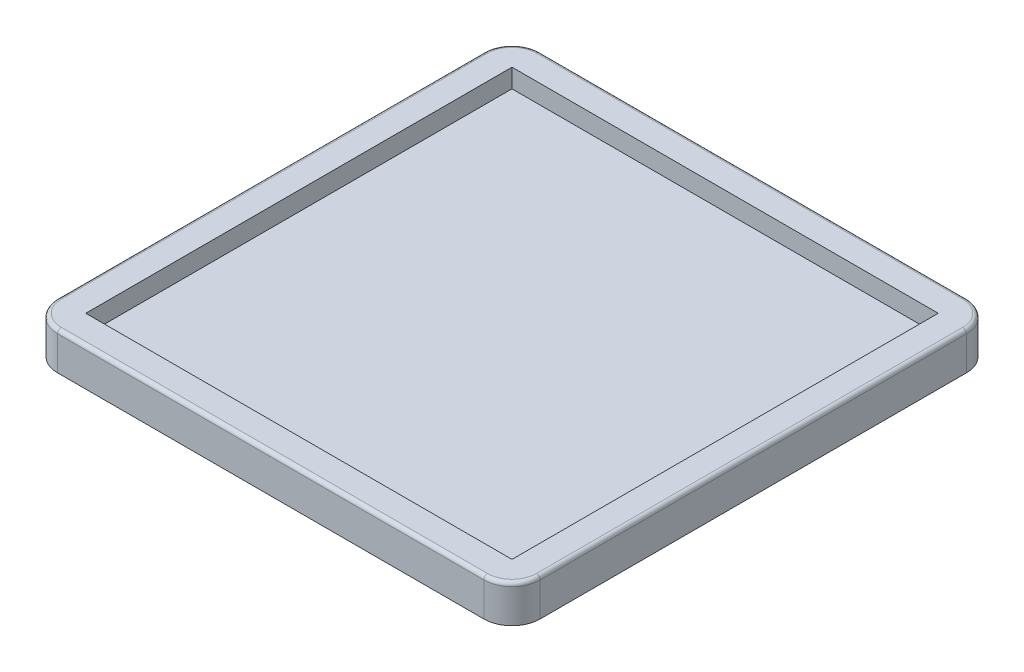
ISO-10303-21;
HEADER;
FILE_DESCRIPTION(('STEP AP214'),'2;1');
FILE_NAME('part.step','',(''),(''),'','','');
FILE_SCHEMA(('AUTOMOTIVE_DESIGN { 1 0 10303 214 1 1 1 1 }'));
ENDSEC;
DATA;
#1=APPLICATION_CONTEXT('core data for automotive mechanical design processes');
#2=APPLICATION_PROTOCOL_DEFINITION('international standard','automotive_design',2000,#1);
#3=PRODUCT_CONTEXT('',#1,'mechanical');
#4=PRODUCT('Part','Part','',(#3));
#5=PRODUCT_RELATED_PRODUCT_CATEGORY('part','',(#4));
#6=PRODUCT_DEFINITION_FORMATION('','',#4);
#7=PRODUCT_DEFINITION_CONTEXT('part definition',#1,'design');
#8=PRODUCT_DEFINITION('design','',#6,#7);
#9=PRODUCT_DEFINITION_SHAPE('','',#8);
#10=(LENGTH_UNIT() NAMED_UNIT(*) SI_UNIT(.MILLI.,.METRE.));
#11=(NAMED_UNIT(*) PLANE_ANGLE_UNIT() SI_UNIT($,.RADIAN.));
#12=(NAMED_UNIT(*) SI_UNIT($,.STERADIAN.) SOLID_ANGLE_UNIT());
#13=UNCERTAINTY_MEASURE_WITH_UNIT(LENGTH_MEASURE(1.E-05),#10,'distance_accuracy_value','');
#14=(GEOMETRIC_REPRESENTATION_CONTEXT(3) GLOBAL_UNCERTAINTY_ASSIGNED_CONTEXT((#13)) GLOBAL_UNIT_ASSIGNED_CONTEXT((#10,
#11,#12)) REPRESENTATION_CONTEXT('',''));
#15=CARTESIAN_POINT('',(0.,0.,0.));
#16=DIRECTION('',(0.,0.,1.));
#17=DIRECTION('',(1.,0.,0.));
#18=AXIS2_PLACEMENT_3D('',#15,#16,#17);
#19=CARTESIAN_POINT('',(64.25,10.,-64.25));
#20=DIRECTION('',(-1.,0.,0.));
#21=DIRECTION('',(0.,0.,1.));
#22=AXIS2_PLACEMENT_3D('',#19,#20,#21);
#23=PLANE('',#22);
#24=DIRECTION('',(0.,-1.,0.));
#25=VECTOR('',#24,1.);
#26=CARTESIAN_POINT('',(64.25,10.,-56.75));
#27=LINE('',#26,#25);
#28=CARTESIAN_POINT('',(64.25,0.,-56.75));
#29=VERTEX_POINT('',#28);
#30=CARTESIAN_POINT('',(64.25,9.,-56.75));
#31=VERTEX_POINT('',#30);
#32=EDGE_CURVE('E205',#29,#31,#27,.F.);
#33=ORIENTED_EDGE('',*,*,#32,.T.);
#34=DIRECTION('',(0.,0.,-1.));
#35=VECTOR('',#34,1.);
#36=CARTESIAN_POINT('',(64.25,9.,56.75));
#37=LINE('',#36,#35);
#38=CARTESIAN_POINT('',(64.25,9.,56.75));
#39=VERTEX_POINT('',#38);
#40=EDGE_CURVE('E255',#31,#39,#37,.F.);
#41=ORIENTED_EDGE('',*,*,#40,.T.);
#42=DIRECTION('',(0.,-1.,0.));
#43=VECTOR('',#42,1.);
#44=CARTESIAN_POINT('',(64.25,10.,56.75));
#45=LINE('',#44,#43);
#46=CARTESIAN_POINT('',(64.25,0.,56.75));
#47=VERTEX_POINT('',#46);
#48=EDGE_CURVE('E208',#39,#47,#45,.T.);
#49=ORIENTED_EDGE('',*,*,#48,.T.);
#50=DIRECTION('',(0.,0.,-1.));
#51=VECTOR('',#50,1.);
#52=CARTESIAN_POINT('',(64.25,0.,-64.25));
#53=LINE('',#52,#51);
#54=EDGE_CURVE('E190',#47,#29,#53,.T.);
#55=ORIENTED_EDGE('',*,*,#54,.T.);
#56=EDGE_LOOP('',(#33,#41,#49,#55));
#57=FACE_BOUND('',#56,.T.);
#58=ADVANCED_FACE('F36',(#57),#23,.F.);
#59=CARTESIAN_POINT('',(-64.25,10.,-64.25));
#60=DIRECTION('',(0.,0.,1.));
#61=DIRECTION('',(1.,0.,0.));
#62=AXIS2_PLACEMENT_3D('',#59,#60,#61);
#63=PLANE('',#62);
#64=DIRECTION('',(0.,-1.,0.));
#65=VECTOR('',#64,1.);
#66=CARTESIAN_POINT('',(-56.75,10.,-64.25));
#67=LINE('',#66,#65);
#68=CARTESIAN_POINT('',(-56.75,0.,-64.25));
#69=VERTEX_POINT('',#68);
#70=CARTESIAN_POINT('',(-56.75,9.,-64.25));
#71=VERTEX_POINT('',#70);
#72=EDGE_CURVE('E222',#69,#71,#67,.F.);
#73=ORIENTED_EDGE('',*,*,#72,.T.);
#74=DIRECTION('',(-1.,0.,0.));
#75=VECTOR('',#74,1.);
#76=CARTESIAN_POINT('',(56.75,9.,-64.25));
#77=LINE('',#76,#75);
#78=CARTESIAN_POINT('',(56.75,9.,-64.25));
#79=VERTEX_POINT('',#78);
#80=EDGE_CURVE('E251',#71,#79,#77,.F.);
#81=ORIENTED_EDGE('',*,*,#80,.T.);
#82=DIRECTION('',(0.,-1.,0.));
#83=VECTOR('',#82,1.);
#84=CARTESIAN_POINT('',(56.75,10.,-64.25));
#85=LINE('',#84,#83);
#86=CARTESIAN_POINT('',(56.75,0.,-64.25));
#87=VERTEX_POINT('',#86);
#88=EDGE_CURVE('E225',#79,#87,#85,.T.);
#89=ORIENTED_EDGE('',*,*,#88,.T.);
#90=DIRECTION('',(-1.,0.,0.));
#91=VECTOR('',#90,1.);
#92=CARTESIAN_POINT('',(-64.25,0.,-64.25));
#93=LINE('',#92,#91);
#94=EDGE_CURVE('E196',#87,#69,#93,.T.);
#95=ORIENTED_EDGE('',*,*,#94,.T.);
#96=EDGE_LOOP('',(#73,#81,#89,#95));
#97=FACE_BOUND('',#96,.T.);
#98=ADVANCED_FACE('F353',(#97),#63,.F.);
#99=CARTESIAN_POINT('',(-64.25,10.,-64.25));
#100=DIRECTION('',(1.,0.,0.));
#101=DIRECTION('',(0.,0.,-1.));
#102=AXIS2_PLACEMENT_3D('',#99,#100,#101);
#103=PLANE('',#102);
#104=DIRECTION('',(0.,-1.,0.));
#105=VECTOR('',#104,1.);
#106=CARTESIAN_POINT('',(-64.25,10.,56.75));
#107=LINE('',#106,#105);
#108=CARTESIAN_POINT('',(-64.25,0.,56.75));
#109=VERTEX_POINT('',#108);
#110=CARTESIAN_POINT('',(-64.25,9.,56.75));
#111=VERTEX_POINT('',#110);
#112=EDGE_CURVE('E227',#109,#111,#107,.F.);
#113=ORIENTED_EDGE('',*,*,#112,.T.);
#114=DIRECTION('',(0.,0.,1.));
#115=VECTOR('',#114,1.);
#116=CARTESIAN_POINT('',(-64.25,9.,-56.75));
#117=LINE('',#116,#115);
#118=CARTESIAN_POINT('',(-64.25,9.,-56.75));
#119=VERTEX_POINT('',#118);
#120=EDGE_CURVE('E11',#111,#119,#117,.F.);
#121=ORIENTED_EDGE('',*,*,#120,.T.);
#122=DIRECTION('',(0.,-1.,0.));
#123=VECTOR('',#122,1.);
#124=CARTESIAN_POINT('',(-64.25,10.,-56.75));
#125=LINE('',#124,#123);
#126=CARTESIAN_POINT('',(-64.25,0.,-56.75));
#127=VERTEX_POINT('',#126);
#128=EDGE_CURVE('E229',#119,#127,#125,.T.);
#129=ORIENTED_EDGE('',*,*,#128,.T.);
#130=DIRECTION('',(0.,0.,1.));
#131=VECTOR('',#130,1.);
#132=CARTESIAN_POINT('',(-64.25,0.,-64.25));
#133=LINE('',#132,#131);
#134=EDGE_CURVE('E199',#127,#109,#133,.T.);
#135=ORIENTED_EDGE('',*,*,#134,.T.);
#136=EDGE_LOOP('',(#113,#121,#129,#135));
#137=FACE_BOUND('',#136,.T.);
#138=ADVANCED_FACE('F337',(#137),#103,.F.);
#139=CARTESIAN_POINT('',(-64.25,10.,64.25));
#140=DIRECTION('',(0.,0.,-1.));
#141=DIRECTION('',(-1.,0.,0.));
#142=AXIS2_PLACEMENT_3D('',#139,#140,#141);
#143=PLANE('',#142);
#144=DIRECTION('',(0.,-1.,0.));
#145=VECTOR('',#144,1.);
#146=CARTESIAN_POINT('',(56.75,10.,64.25));
#147=LINE('',#146,#145);
#148=CARTESIAN_POINT('',(56.75,0.,64.25));
#149=VERTEX_POINT('',#148);
#150=CARTESIAN_POINT('',(56.75,9.,64.25));
#151=VERTEX_POINT('',#150);
#152=EDGE_CURVE('E220',#149,#151,#147,.F.);
#153=ORIENTED_EDGE('',*,*,#152,.T.);
#154=DIRECTION('',(1.,0.,0.));
#155=VECTOR('',#154,1.);
#156=CARTESIAN_POINT('',(-56.75,9.,64.25));
#157=LINE('',#156,#155);
#158=CARTESIAN_POINT('',(-56.75,9.,64.25));
#159=VERTEX_POINT('',#158);
#160=EDGE_CURVE('E60',#151,#159,#157,.F.);
#161=ORIENTED_EDGE('',*,*,#160,.T.);
#162=DIRECTION('',(0.,-1.,0.));
#163=VECTOR('',#162,1.);
#164=CARTESIAN_POINT('',(-56.75,10.,64.25));
#165=LINE('',#164,#163);
#166=CARTESIAN_POINT('',(-56.75,0.,64.25));
#167=VERTEX_POINT('',#166);
#168=EDGE_CURVE('E218',#159,#167,#165,.T.);
#169=ORIENTED_EDGE('',*,*,#168,.T.);
#170=DIRECTION('',(1.,0.,0.));
#171=VECTOR('',#170,1.);
#172=CARTESIAN_POINT('',(-64.25,0.,64.25));
#173=LINE('',#172,#171);
#174=EDGE_CURVE('E202',#167,#149,#173,.T.);
#175=ORIENTED_EDGE('',*,*,#174,.T.);
#176=EDGE_LOOP('',(#153,#161,#169,#175));
#177=FACE_BOUND('',#176,.T.);
#178=ADVANCED_FACE('F296',(#177),#143,.F.);
#179=CARTESIAN_POINT('',(0.,10.,0.));
#180=DIRECTION('',(0.,1.,0.));
#181=DIRECTION('',(0.,0.,1.));
#182=AXIS2_PLACEMENT_3D('',#179,#180,#181);
#183=PLANE('',#182);
#184=DIRECTION('',(-1.,0.,0.));
#185=VECTOR('',#184,1.);
#186=CARTESIAN_POINT('',(-56.75,10.,-63.25));
#187=LINE('',#186,#185);
#188=CARTESIAN_POINT('',(56.75,10.,-63.25));
#189=VERTEX_POINT('',#188);
#190=CARTESIAN_POINT('',(-56.75,10.,-63.25));
#191=VERTEX_POINT('',#190);
#192=EDGE_CURVE('E243',#189,#191,#187,.T.);
#193=ORIENTED_EDGE('',*,*,#192,.T.);
#194=CARTESIAN_POINT('',(-56.75,10.,-56.75));
#195=DIRECTION('',(0.,1.,0.));
#196=DIRECTION('',(0.,0.,1.));
#197=AXIS2_PLACEMENT_3D('',#194,#195,#196);
#198=CIRCLE('',#197,6.5);
#199=CARTESIAN_POINT('',(-63.25,10.,-56.75));
#200=VERTEX_POINT('',#199);
#201=EDGE_CURVE('E245',#191,#200,#198,.T.);
#202=ORIENTED_EDGE('',*,*,#201,.T.);
#203=DIRECTION('',(0.,0.,1.));
#204=VECTOR('',#203,1.);
#205=CARTESIAN_POINT('',(-63.25,10.,56.75));
#206=LINE('',#205,#204);
#207=CARTESIAN_POINT('',(-63.25,10.,56.75));
#208=VERTEX_POINT('',#207);
#209=EDGE_CURVE('E231',#200,#208,#206,.T.);
#210=ORIENTED_EDGE('',*,*,#209,.T.);
#211=CARTESIAN_POINT('',(-56.75,10.,56.75));
#212=DIRECTION('',(0.,1.,0.));
#213=DIRECTION('',(0.,0.,1.));
#214=AXIS2_PLACEMENT_3D('',#211,#212,#213);
#215=CIRCLE('',#214,6.5);
#216=CARTESIAN_POINT('',(-56.75,10.,63.25));
#217=VERTEX_POINT('',#216);
#218=EDGE_CURVE('E233',#208,#217,#215,.T.);
#219=ORIENTED_EDGE('',*,*,#218,.T.);
#220=DIRECTION('',(1.,0.,0.));
#221=VECTOR('',#220,1.);
#222=CARTESIAN_POINT('',(56.75,10.,63.25));
#223=LINE('',#222,#221);
#224=CARTESIAN_POINT('',(56.75,10.,63.25));
#225=VERTEX_POINT('',#224);
#226=EDGE_CURVE('E235',#217,#225,#223,.T.);
#227=ORIENTED_EDGE('',*,*,#226,.T.);
#228=CARTESIAN_POINT('',(56.75,10.,56.75));
#229=DIRECTION('',(0.,1.,0.));
#230=DIRECTION('',(0.,0.,1.));
#231=AXIS2_PLACEMENT_3D('',#228,#229,#230);
#232=CIRCLE('',#231,6.5);
#233=CARTESIAN_POINT('',(63.25,10.,56.75));
#234=VERTEX_POINT('',#233);
#235=EDGE_CURVE('E237',#225,#234,#232,.T.);
#236=ORIENTED_EDGE('',*,*,#235,.T.);
#237=DIRECTION('',(0.,0.,-1.));
#238=VECTOR('',#237,1.);
#239=CARTESIAN_POINT('',(63.25,10.,-56.75));
#240=LINE('',#239,#238);
#241=CARTESIAN_POINT('',(63.25,10.,-56.75));
#242=VERTEX_POINT('',#241);
#243=EDGE_CURVE('E239',#234,#242,#240,.T.);
#244=ORIENTED_EDGE('',*,*,#243,.T.);
#245=CARTESIAN_POINT('',(56.75,10.,-56.75));
#246=DIRECTION('',(0.,1.,0.));
#247=DIRECTION('',(0.,0.,1.));
#248=AXIS2_PLACEMENT_3D('',#245,#246,#247);
#249=CIRCLE('',#248,6.5);
#250=EDGE_CURVE('E241',#242,#189,#249,.T.);
#251=ORIENTED_EDGE('',*,*,#250,.T.);
#252=EDGE_LOOP('',(#193,#202,#210,#219,#227,#236,#244,#251));
#253=FACE_BOUND('',#252,.T.);
#254=DIRECTION('',(0.,0.,-1.));
#255=VECTOR('',#254,1.);
#256=CARTESIAN_POINT('',(56.75,10.,-56.75));
#257=LINE('',#256,#255);
#258=CARTESIAN_POINT('',(56.75,10.,56.75));
#259=VERTEX_POINT('',#258);
#260=CARTESIAN_POINT('',(56.75,10.,-56.75));
#261=VERTEX_POINT('',#260);
#262=EDGE_CURVE('E158',#259,#261,#257,.T.);
#263=ORIENTED_EDGE('',*,*,#262,.F.);
#264=DIRECTION('',(1.,0.,0.));
#265=VECTOR('',#264,1.);
#266=CARTESIAN_POINT('',(-56.75,10.,56.75));
#267=LINE('',#266,#265);
#268=CARTESIAN_POINT('',(-56.75,10.,56.75));
#269=VERTEX_POINT('',#268);
#270=EDGE_CURVE('E175',#269,#259,#267,.T.);
#271=ORIENTED_EDGE('',*,*,#270,.F.);
#272=DIRECTION('',(0.,0.,1.));
#273=VECTOR('',#272,1.);
#274=CARTESIAN_POINT('',(-56.75,10.,-56.75));
#275=LINE('',#274,#273);
#276=CARTESIAN_POINT('',(-56.75,10.,-56.75));
#277=VERTEX_POINT('',#276);
#278=EDGE_CURVE('E178',#277,#269,#275,.T.);
#279=ORIENTED_EDGE('',*,*,#278,.F.);
#280=DIRECTION('',(-1.,0.,0.));
#281=VECTOR('',#280,1.);
#282=CARTESIAN_POINT('',(-56.75,10.,-56.75));
#283=LINE('',#282,#281);
#284=EDGE_CURVE('E184',#261,#277,#283,.T.);
#285=ORIENTED_EDGE('',*,*,#284,.F.);
#286=EDGE_LOOP('',(#263,#271,#279,#285));
#287=FACE_BOUND('',#286,.T.);
#288=ADVANCED_FACE('F322',(#253,#287),#183,.T.);
#289=CARTESIAN_POINT('',(0.,0.,0.));
#290=DIRECTION('',(0.,1.,0.));
#291=DIRECTION('',(0.,0.,1.));
#292=AXIS2_PLACEMENT_3D('',#289,#290,#291);
#293=PLANE('',#292);
#294=ORIENTED_EDGE('',*,*,#54,.F.);
#295=CARTESIAN_POINT('',(56.75,0.,56.75));
#296=DIRECTION('',(0.,1.,0.));
#297=DIRECTION('',(0.,0.,1.));
#298=AXIS2_PLACEMENT_3D('',#295,#296,#297);
#299=CIRCLE('',#298,7.5);
#300=EDGE_CURVE('E216',#47,#149,#299,.F.);
#301=ORIENTED_EDGE('',*,*,#300,.T.);
#302=ORIENTED_EDGE('',*,*,#174,.F.);
#303=CARTESIAN_POINT('',(-56.75,0.,56.75));
#304=DIRECTION('',(0.,1.,0.));
#305=DIRECTION('',(0.,0.,1.));
#306=AXIS2_PLACEMENT_3D('',#303,#304,#305);
#307=CIRCLE('',#306,7.5);
#308=EDGE_CURVE('E210',#167,#109,#307,.F.);
#309=ORIENTED_EDGE('',*,*,#308,.T.);
#310=ORIENTED_EDGE('',*,*,#134,.F.);
#311=CARTESIAN_POINT('',(-56.75,0.,-56.75));
#312=DIRECTION('',(0.,1.,0.));
#313=DIRECTION('',(0.,0.,1.));
#314=AXIS2_PLACEMENT_3D('',#311,#312,#313);
#315=CIRCLE('',#314,7.5);
#316=EDGE_CURVE('E212',#127,#69,#315,.F.);
#317=ORIENTED_EDGE('',*,*,#316,.T.);
#318=ORIENTED_EDGE('',*,*,#94,.F.);
#319=CARTESIAN_POINT('',(56.75,0.,-56.75));
#320=DIRECTION('',(0.,1.,0.));
#321=DIRECTION('',(0.,0.,1.));
#322=AXIS2_PLACEMENT_3D('',#319,#320,#321);
#323=CIRCLE('',#322,7.5);
#324=EDGE_CURVE('E214',#87,#29,#323,.F.);
#325=ORIENTED_EDGE('',*,*,#324,.T.);
#326=EDGE_LOOP('',(#294,#301,#302,#309,#310,#317,#318,#325));
#327=FACE_BOUND('',#326,.T.);
#328=ADVANCED_FACE('F301',(#327),#293,.F.);
#329=CARTESIAN_POINT('',(56.75,5.,-56.75));
#330=DIRECTION('',(1.,0.,0.));
#331=DIRECTION('',(0.,0.,-1.));
#332=AXIS2_PLACEMENT_3D('',#329,#330,#331);
#333=PLANE('',#332);
#334=ORIENTED_EDGE('',*,*,#262,.T.);
#335=DIRECTION('',(0.,1.,0.));
#336=VECTOR('',#335,1.);
#337=CARTESIAN_POINT('',(56.75,5.,-56.75));
#338=LINE('',#337,#336);
#339=CARTESIAN_POINT('',(56.75,5.,-56.75));
#340=VERTEX_POINT('',#339);
#341=EDGE_CURVE('E151',#340,#261,#338,.T.);
#342=ORIENTED_EDGE('',*,*,#341,.F.);
#343=DIRECTION('',(0.,0.,-1.));
#344=VECTOR('',#343,1.);
#345=CARTESIAN_POINT('',(56.75,5.,-56.75));
#346=LINE('',#345,#344);
#347=CARTESIAN_POINT('',(56.75,5.,56.75));
#348=VERTEX_POINT('',#347);
#349=EDGE_CURVE('E155',#348,#340,#346,.T.);
#350=ORIENTED_EDGE('',*,*,#349,.F.);
#351=DIRECTION('',(0.,1.,0.));
#352=VECTOR('',#351,1.);
#353=CARTESIAN_POINT('',(56.75,5.,56.75));
#354=LINE('',#353,#352);
#355=EDGE_CURVE('E188',#348,#259,#354,.T.);
#356=ORIENTED_EDGE('',*,*,#355,.T.);
#357=EDGE_LOOP('',(#334,#342,#350,#356));
#358=FACE_BOUND('',#357,.T.);
#359=ADVANCED_FACE('F153',(#358),#333,.F.);
#360=CARTESIAN_POINT('',(-56.75,5.,56.75));
#361=DIRECTION('',(0.,0.,1.));
#362=DIRECTION('',(1.,0.,0.));
#363=AXIS2_PLACEMENT_3D('',#360,#361,#362);
#364=PLANE('',#363);
#365=ORIENTED_EDGE('',*,*,#270,.T.);
#366=ORIENTED_EDGE('',*,*,#355,.F.);
#367=DIRECTION('',(1.,0.,0.));
#368=VECTOR('',#367,1.);
#369=CARTESIAN_POINT('',(-56.75,5.,56.75));
#370=LINE('',#369,#368);
#371=CARTESIAN_POINT('',(-56.75,5.,56.75));
#372=VERTEX_POINT('',#371);
#373=EDGE_CURVE('E163',#372,#348,#370,.T.);
#374=ORIENTED_EDGE('',*,*,#373,.F.);
#375=DIRECTION('',(0.,1.,0.));
#376=VECTOR('',#375,1.);
#377=CARTESIAN_POINT('',(-56.75,5.,56.75));
#378=LINE('',#377,#376);
#379=EDGE_CURVE('E191',#372,#269,#378,.T.);
#380=ORIENTED_EDGE('',*,*,#379,.T.);
#381=EDGE_LOOP('',(#365,#366,#374,#380));
#382=FACE_BOUND('',#381,.T.);
#383=ADVANCED_FACE('F467',(#382),#364,.F.);
#384=CARTESIAN_POINT('',(-56.75,5.,-56.75));
#385=DIRECTION('',(-1.,0.,0.));
#386=DIRECTION('',(0.,0.,1.));
#387=AXIS2_PLACEMENT_3D('',#384,#385,#386);
#388=PLANE('',#387);
#389=ORIENTED_EDGE('',*,*,#278,.T.);
#390=ORIENTED_EDGE('',*,*,#379,.F.);
#391=DIRECTION('',(0.,0.,1.));
#392=VECTOR('',#391,1.);
#393=CARTESIAN_POINT('',(-56.75,5.,-56.75));
#394=LINE('',#393,#392);
#395=CARTESIAN_POINT('',(-56.75,5.,-56.75));
#396=VERTEX_POINT('',#395);
#397=EDGE_CURVE('E171',#396,#372,#394,.T.);
#398=ORIENTED_EDGE('',*,*,#397,.F.);
#399=DIRECTION('',(0.,1.,0.));
#400=VECTOR('',#399,1.);
#401=CARTESIAN_POINT('',(-56.75,5.,-56.75));
#402=LINE('',#401,#400);
#403=EDGE_CURVE('E162',#396,#277,#402,.T.);
#404=ORIENTED_EDGE('',*,*,#403,.T.);
#405=EDGE_LOOP('',(#389,#390,#398,#404));
#406=FACE_BOUND('',#405,.T.);
#407=ADVANCED_FACE('F459',(#406),#388,.F.);
#408=CARTESIAN_POINT('',(-56.75,5.,-56.75));
#409=DIRECTION('',(0.,0.,-1.));
#410=DIRECTION('',(-1.,0.,0.));
#411=AXIS2_PLACEMENT_3D('',#408,#409,#410);
#412=PLANE('',#411);
#413=ORIENTED_EDGE('',*,*,#284,.T.);
#414=ORIENTED_EDGE('',*,*,#403,.F.);
#415=DIRECTION('',(-1.,0.,0.));
#416=VECTOR('',#415,1.);
#417=CARTESIAN_POINT('',(-56.75,5.,-56.75));
#418=LINE('',#417,#416);
#419=EDGE_CURVE('E166',#340,#396,#418,.T.);
#420=ORIENTED_EDGE('',*,*,#419,.F.);
#421=ORIENTED_EDGE('',*,*,#341,.T.);
#422=EDGE_LOOP('',(#413,#414,#420,#421));
#423=FACE_BOUND('',#422,.T.);
#424=ADVANCED_FACE('F167',(#423),#412,.F.);
#425=CARTESIAN_POINT('',(0.,5.,0.));
#426=DIRECTION('',(0.,1.,0.));
#427=DIRECTION('',(0.,0.,1.));
#428=AXIS2_PLACEMENT_3D('',#425,#426,#427);
#429=PLANE('',#428);
#430=ORIENTED_EDGE('',*,*,#349,.T.);
#431=ORIENTED_EDGE('',*,*,#419,.T.);
#432=ORIENTED_EDGE('',*,*,#397,.T.);
#433=ORIENTED_EDGE('',*,*,#373,.T.);
#434=EDGE_LOOP('',(#430,#431,#432,#433));
#435=FACE_BOUND('',#434,.T.);
#436=ADVANCED_FACE('F173',(#435),#429,.T.);
#437=CARTESIAN_POINT('',(56.75,10.,56.75));
#438=DIRECTION('',(0.,-1.,0.));
#439=DIRECTION('',(0.,0.,-1.));
#440=AXIS2_PLACEMENT_3D('',#437,#438,#439);
#441=CYLINDRICAL_SURFACE('',#440,7.5);
#442=ORIENTED_EDGE('',*,*,#48,.F.);
#443=CARTESIAN_POINT('',(56.75,9.,56.75));
#444=DIRECTION('',(0.,1.,0.));
#445=DIRECTION('',(0.,0.,1.));
#446=AXIS2_PLACEMENT_3D('',#443,#444,#445);
#447=CIRCLE('',#446,7.5);
#448=EDGE_CURVE('E257',#39,#151,#447,.F.);
#449=ORIENTED_EDGE('',*,*,#448,.T.);
#450=ORIENTED_EDGE('',*,*,#152,.F.);
#451=ORIENTED_EDGE('',*,*,#300,.F.);
#452=EDGE_LOOP('',(#442,#449,#450,#451));
#453=FACE_BOUND('',#452,.T.);
#454=ADVANCED_FACE('F294',(#453),#441,.T.);
#455=CARTESIAN_POINT('',(56.75,10.,-56.75));
#456=DIRECTION('',(0.,-1.,0.));
#457=DIRECTION('',(0.,0.,-1.));
#458=AXIS2_PLACEMENT_3D('',#455,#456,#457);
#459=CYLINDRICAL_SURFACE('',#458,7.5);
#460=ORIENTED_EDGE('',*,*,#88,.F.);
#461=CARTESIAN_POINT('',(56.75,9.,-56.75));
#462=DIRECTION('',(0.,1.,0.));
#463=DIRECTION('',(0.,0.,1.));
#464=AXIS2_PLACEMENT_3D('',#461,#462,#463);
#465=CIRCLE('',#464,7.5);
#466=EDGE_CURVE('E253',#79,#31,#465,.F.);
#467=ORIENTED_EDGE('',*,*,#466,.T.);
#468=ORIENTED_EDGE('',*,*,#32,.F.);
#469=ORIENTED_EDGE('',*,*,#324,.F.);
#470=EDGE_LOOP('',(#460,#467,#468,#469));
#471=FACE_BOUND('',#470,.T.);
#472=ADVANCED_FACE('F309',(#471),#459,.T.);
#473=CARTESIAN_POINT('',(-56.75,10.,-56.75));
#474=DIRECTION('',(0.,-1.,0.));
#475=DIRECTION('',(0.,0.,-1.));
#476=AXIS2_PLACEMENT_3D('',#473,#474,#475);
#477=CYLINDRICAL_SURFACE('',#476,7.5);
#478=ORIENTED_EDGE('',*,*,#128,.F.);
#479=CARTESIAN_POINT('',(-56.75,9.,-56.75));
#480=DIRECTION('',(0.,1.,0.));
#481=DIRECTION('',(0.,0.,1.));
#482=AXIS2_PLACEMENT_3D('',#479,#480,#481);
#483=CIRCLE('',#482,7.5);
#484=EDGE_CURVE('E248',#119,#71,#483,.F.);
#485=ORIENTED_EDGE('',*,*,#484,.T.);
#486=ORIENTED_EDGE('',*,*,#72,.F.);
#487=ORIENTED_EDGE('',*,*,#316,.F.);
#488=EDGE_LOOP('',(#478,#485,#486,#487));
#489=FACE_BOUND('',#488,.T.);
#490=ADVANCED_FACE('F341',(#489),#477,.T.);
#491=CARTESIAN_POINT('',(-56.75,10.,56.75));
#492=DIRECTION('',(0.,-1.,0.));
#493=DIRECTION('',(0.,0.,-1.));
#494=AXIS2_PLACEMENT_3D('',#491,#492,#493);
#495=CYLINDRICAL_SURFACE('',#494,7.5);
#496=ORIENTED_EDGE('',*,*,#168,.F.);
#497=CARTESIAN_POINT('',(-56.75,9.,56.75));
#498=DIRECTION('',(0.,1.,0.));
#499=DIRECTION('',(0.,0.,1.));
#500=AXIS2_PLACEMENT_3D('',#497,#498,#499);
#501=CIRCLE('',#500,7.5);
#502=EDGE_CURVE('E45',#159,#111,#501,.F.);
#503=ORIENTED_EDGE('',*,*,#502,.T.);
#504=ORIENTED_EDGE('',*,*,#112,.F.);
#505=ORIENTED_EDGE('',*,*,#308,.F.);
#506=EDGE_LOOP('',(#496,#503,#504,#505));
#507=FACE_BOUND('',#506,.T.);
#508=ADVANCED_FACE('F367',(#507),#495,.T.);
#509=CARTESIAN_POINT('',(56.75,9.,56.75));
#510=DIRECTION('',(0.,1.,0.));
#511=DIRECTION('',(0.,0.,1.));
#512=AXIS2_PLACEMENT_3D('',#509,#510,#511);
#513=TOROIDAL_SURFACE('',#512,6.5,1.);
#514=CARTESIAN_POINT('',(56.75,9.,63.25));
#515=DIRECTION('',(-1.,0.,0.));
#516=DIRECTION('',(0.,0.,1.));
#517=AXIS2_PLACEMENT_3D('',#514,#515,#516);
#518=CIRCLE('',#517,1.);
#519=EDGE_CURVE('E276',#151,#225,#518,.T.);
#520=ORIENTED_EDGE('',*,*,#519,.F.);
#521=ORIENTED_EDGE('',*,*,#448,.F.);
#522=CARTESIAN_POINT('',(63.25,9.,56.75));
#523=DIRECTION('',(0.,0.,-1.));
#524=DIRECTION('',(-1.,0.,0.));
#525=AXIS2_PLACEMENT_3D('',#522,#523,#524);
#526=CIRCLE('',#525,1.);
#527=EDGE_CURVE('E40',#234,#39,#526,.T.);
#528=ORIENTED_EDGE('',*,*,#527,.F.);
#529=ORIENTED_EDGE('',*,*,#235,.F.);
#530=EDGE_LOOP('',(#520,#521,#528,#529));
#531=FACE_BOUND('',#530,.T.);
#532=ADVANCED_FACE('F38',(#531),#513,.T.);
#533=CARTESIAN_POINT('',(63.25,9.,0.));
#534=DIRECTION('',(0.,0.,1.));
#535=DIRECTION('',(1.,0.,0.));
#536=AXIS2_PLACEMENT_3D('',#533,#534,#535);
#537=CYLINDRICAL_SURFACE('',#536,1.);
#538=ORIENTED_EDGE('',*,*,#527,.T.);
#539=ORIENTED_EDGE('',*,*,#40,.F.);
#540=CARTESIAN_POINT('',(63.25,9.,-56.75));
#541=DIRECTION('',(0.,0.,-1.));
#542=DIRECTION('',(-1.,0.,0.));
#543=AXIS2_PLACEMENT_3D('',#540,#541,#542);
#544=CIRCLE('',#543,1.);
#545=EDGE_CURVE('E274',#242,#31,#544,.T.);
#546=ORIENTED_EDGE('',*,*,#545,.F.);
#547=ORIENTED_EDGE('',*,*,#243,.F.);
#548=EDGE_LOOP('',(#538,#539,#546,#547));
#549=FACE_BOUND('',#548,.T.);
#550=ADVANCED_FACE('F286',(#549),#537,.T.);
#551=CARTESIAN_POINT('',(0.,9.,63.25));
#552=DIRECTION('',(-1.,0.,0.));
#553=DIRECTION('',(0.,0.,1.));
#554=AXIS2_PLACEMENT_3D('',#551,#552,#553);
#555=CYLINDRICAL_SURFACE('',#554,1.);
#556=ORIENTED_EDGE('',*,*,#519,.T.);
#557=ORIENTED_EDGE('',*,*,#226,.F.);
#558=CARTESIAN_POINT('',(-56.75,9.,63.25));
#559=DIRECTION('',(-1.,0.,0.));
#560=DIRECTION('',(0.,0.,1.));
#561=AXIS2_PLACEMENT_3D('',#558,#559,#560);
#562=CIRCLE('',#561,1.);
#563=EDGE_CURVE('E271',#159,#217,#562,.T.);
#564=ORIENTED_EDGE('',*,*,#563,.F.);
#565=ORIENTED_EDGE('',*,*,#160,.F.);
#566=EDGE_LOOP('',(#556,#557,#564,#565));
#567=FACE_BOUND('',#566,.T.);
#568=ADVANCED_FACE('F326',(#567),#555,.T.);
#569=CARTESIAN_POINT('',(56.75,9.,-56.75));
#570=DIRECTION('',(0.,1.,0.));
#571=DIRECTION('',(0.,0.,1.));
#572=AXIS2_PLACEMENT_3D('',#569,#570,#571);
#573=TOROIDAL_SURFACE('',#572,6.5,1.);
#574=ORIENTED_EDGE('',*,*,#545,.T.);
#575=ORIENTED_EDGE('',*,*,#466,.F.);
#576=CARTESIAN_POINT('',(56.75,9.,-63.25));
#577=DIRECTION('',(-1.,0.,0.));
#578=DIRECTION('',(0.,0.,1.));
#579=AXIS2_PLACEMENT_3D('',#576,#577,#578);
#580=CIRCLE('',#579,1.);
#581=EDGE_CURVE('E268',#189,#79,#580,.T.);
#582=ORIENTED_EDGE('',*,*,#581,.F.);
#583=ORIENTED_EDGE('',*,*,#250,.F.);
#584=EDGE_LOOP('',(#574,#575,#582,#583));
#585=FACE_BOUND('',#584,.T.);
#586=ADVANCED_FACE('F313',(#585),#573,.T.);
#587=CARTESIAN_POINT('',(-56.75,9.,56.75));
#588=DIRECTION('',(0.,1.,0.));
#589=DIRECTION('',(0.,0.,1.));
#590=AXIS2_PLACEMENT_3D('',#587,#588,#589);
#591=TOROIDAL_SURFACE('',#590,6.5,1.);
#592=ORIENTED_EDGE('',*,*,#563,.T.);
#593=ORIENTED_EDGE('',*,*,#218,.F.);
#594=CARTESIAN_POINT('',(-63.25,9.,56.75));
#595=DIRECTION('',(0.,0.,-1.));
#596=DIRECTION('',(-1.,0.,0.));
#597=AXIS2_PLACEMENT_3D('',#594,#595,#596);
#598=CIRCLE('',#597,1.);
#599=EDGE_CURVE('E265',#111,#208,#598,.T.);
#600=ORIENTED_EDGE('',*,*,#599,.F.);
#601=ORIENTED_EDGE('',*,*,#502,.F.);
#602=EDGE_LOOP('',(#592,#593,#600,#601));
#603=FACE_BOUND('',#602,.T.);
#604=ADVANCED_FACE('F328',(#603),#591,.T.);
#605=CARTESIAN_POINT('',(0.,9.,-63.25));
#606=DIRECTION('',(1.,0.,0.));
#607=DIRECTION('',(0.,0.,-1.));
#608=AXIS2_PLACEMENT_3D('',#605,#606,#607);
#609=CYLINDRICAL_SURFACE('',#608,1.);
#610=ORIENTED_EDGE('',*,*,#581,.T.);
#611=ORIENTED_EDGE('',*,*,#80,.F.);
#612=CARTESIAN_POINT('',(-56.75,9.,-63.25));
#613=DIRECTION('',(-1.,0.,0.));
#614=DIRECTION('',(0.,0.,1.));
#615=AXIS2_PLACEMENT_3D('',#612,#613,#614);
#616=CIRCLE('',#615,1.);
#617=EDGE_CURVE('E263',#191,#71,#616,.T.);
#618=ORIENTED_EDGE('',*,*,#617,.F.);
#619=ORIENTED_EDGE('',*,*,#192,.F.);
#620=EDGE_LOOP('',(#610,#611,#618,#619));
#621=FACE_BOUND('',#620,.T.);
#622=ADVANCED_FACE('F318',(#621),#609,.T.);
#623=CARTESIAN_POINT('',(-63.25,9.,0.));
#624=DIRECTION('',(0.,0.,-1.));
#625=DIRECTION('',(-1.,0.,0.));
#626=AXIS2_PLACEMENT_3D('',#623,#624,#625);
#627=CYLINDRICAL_SURFACE('',#626,1.);
#628=ORIENTED_EDGE('',*,*,#599,.T.);
#629=ORIENTED_EDGE('',*,*,#209,.F.);
#630=CARTESIAN_POINT('',(-63.25,9.,-56.75));
#631=DIRECTION('',(0.,0.,-1.));
#632=DIRECTION('',(-1.,0.,0.));
#633=AXIS2_PLACEMENT_3D('',#630,#631,#632);
#634=CIRCLE('',#633,1.);
#635=EDGE_CURVE('E261',#119,#200,#634,.T.);
#636=ORIENTED_EDGE('',*,*,#635,.F.);
#637=ORIENTED_EDGE('',*,*,#120,.F.);
#638=EDGE_LOOP('',(#628,#629,#636,#637));
#639=FACE_BOUND('',#638,.T.);
#640=ADVANCED_FACE('F334',(#639),#627,.T.);
#641=CARTESIAN_POINT('',(-56.75,9.,-56.75));
#642=DIRECTION('',(0.,1.,0.));
#643=DIRECTION('',(0.,0.,1.));
#644=AXIS2_PLACEMENT_3D('',#641,#642,#643);
#645=TOROIDAL_SURFACE('',#644,6.5,1.);
#646=ORIENTED_EDGE('',*,*,#617,.T.);
#647=ORIENTED_EDGE('',*,*,#484,.F.);
#648=ORIENTED_EDGE('',*,*,#635,.T.);
#649=ORIENTED_EDGE('',*,*,#201,.F.);
#650=EDGE_LOOP('',(#646,#647,#648,#649));
#651=FACE_BOUND('',#650,.T.);
#652=ADVANCED_FACE('F344',(#651),#645,.T.);
#653=CLOSED_SHELL('',(#58,#98,#138,#178,#288,#328,#359,#383,#407,#424,#436,#454,#472,#490,#508,
#532,#550,#568,#586,#604,#622,#640,#652));
#654=MANIFOLD_SOLID_BREP('B2',#653);
#655=ADVANCED_BREP_SHAPE_REPRESENTATION('',(#18,#654),#14);
#656=SHAPE_DEFINITION_REPRESENTATION(#9,#655);
ENDSEC;
END-ISO-10303-21;
